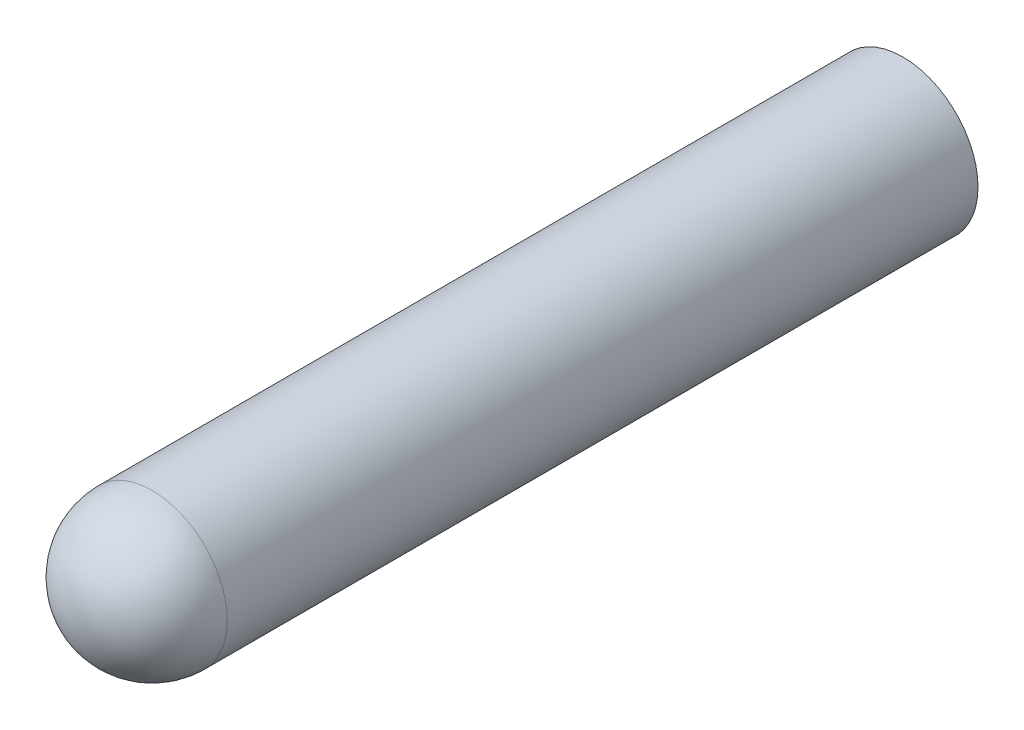
ISO-10303-21;
HEADER;
FILE_DESCRIPTION(('STEP AP214'),'2;1');
FILE_NAME('part.step','',(''),(''),'','','');
FILE_SCHEMA(('AUTOMOTIVE_DESIGN { 1 0 10303 214 1 1 1 1 }'));
ENDSEC;
DATA;
#1=APPLICATION_CONTEXT('core data for automotive mechanical design processes');
#2=APPLICATION_PROTOCOL_DEFINITION('international standard','automotive_design',2000,#1);
#3=PRODUCT_CONTEXT('',#1,'mechanical');
#4=PRODUCT('Part','Part','',(#3));
#5=PRODUCT_RELATED_PRODUCT_CATEGORY('part','',(#4));
#6=PRODUCT_DEFINITION_FORMATION('','',#4);
#7=PRODUCT_DEFINITION_CONTEXT('part definition',#1,'design');
#8=PRODUCT_DEFINITION('design','',#6,#7);
#9=PRODUCT_DEFINITION_SHAPE('','',#8);
#10=(LENGTH_UNIT() NAMED_UNIT(*) SI_UNIT(.MILLI.,.METRE.));
#11=(NAMED_UNIT(*) PLANE_ANGLE_UNIT() SI_UNIT($,.RADIAN.));
#12=(NAMED_UNIT(*) SI_UNIT($,.STERADIAN.) SOLID_ANGLE_UNIT());
#13=UNCERTAINTY_MEASURE_WITH_UNIT(LENGTH_MEASURE(1.E-05),#10,'distance_accuracy_value','');
#14=(GEOMETRIC_REPRESENTATION_CONTEXT(3) GLOBAL_UNCERTAINTY_ASSIGNED_CONTEXT((#13)) GLOBAL_UNIT_ASSIGNED_CONTEXT((#10,
#11,#12)) REPRESENTATION_CONTEXT('',''));
#15=CARTESIAN_POINT('',(0.,0.,0.));
#16=DIRECTION('',(0.,0.,1.));
#17=DIRECTION('',(1.,0.,0.));
#18=AXIS2_PLACEMENT_3D('',#15,#16,#17);
#19=CARTESIAN_POINT('',(0.,0.,5.5));
#20=DIRECTION('',(0.,0.,-1.));
#21=DIRECTION('',(-1.,0.,0.));
#22=AXIS2_PLACEMENT_3D('',#19,#20,#21);
#23=CYLINDRICAL_SURFACE('',#22,1.);
#24=CARTESIAN_POINT('',(0.,0.,4.5));
#25=DIRECTION('',(0.,0.,-1.));
#26=DIRECTION('',(-1.,0.,0.));
#27=AXIS2_PLACEMENT_3D('',#24,#25,#26);
#28=CIRCLE('',#27,1.);
#29=CARTESIAN_POINT('',(-1.,0.,4.5));
#30=VERTEX_POINT('',#29);
#31=EDGE_CURVE('E10',#30,#30,#28,.T.);
#32=ORIENTED_EDGE('',*,*,#31,.T.);
#33=EDGE_LOOP('',(#32));
#34=FACE_BOUND('',#33,.T.);
#35=CARTESIAN_POINT('',(0.,0.,-5.5));
#36=DIRECTION('',(0.,0.,1.));
#37=DIRECTION('',(1.,0.,0.));
#38=AXIS2_PLACEMENT_3D('',#35,#36,#37);
#39=CIRCLE('',#38,1.);
#40=CARTESIAN_POINT('',(1.,0.,-5.5));
#41=VERTEX_POINT('',#40);
#42=EDGE_CURVE('E38',#41,#41,#39,.T.);
#43=ORIENTED_EDGE('',*,*,#42,.T.);
#44=EDGE_LOOP('',(#43));
#45=FACE_BOUND('',#44,.T.);
#46=ADVANCED_FACE('F31',(#34,#45),#23,.T.);
#47=CARTESIAN_POINT('',(0.,0.,-5.5));
#48=DIRECTION('',(0.,0.,1.));
#49=DIRECTION('',(1.,0.,0.));
#50=AXIS2_PLACEMENT_3D('',#47,#48,#49);
#51=PLANE('',#50);
#52=ORIENTED_EDGE('',*,*,#42,.F.);
#53=EDGE_LOOP('',(#52));
#54=FACE_BOUND('',#53,.T.);
#55=ADVANCED_FACE('F45',(#54),#51,.F.);
#56=CARTESIAN_POINT('',(0.,0.,4.5));
#57=DIRECTION('',(0.,0.,1.));
#58=DIRECTION('',(1.,0.,0.));
#59=AXIS2_PLACEMENT_3D('',#56,#57,#58);
#60=SPHERICAL_SURFACE('',#59,1.);
#61=ORIENTED_EDGE('',*,*,#31,.F.);
#62=EDGE_LOOP('',(#61));
#63=FACE_BOUND('',#62,.T.);
#64=ADVANCED_FACE('F33',(#63),#60,.T.);
#65=CLOSED_SHELL('',(#46,#55,#64));
#66=MANIFOLD_SOLID_BREP('B2',#65);
#67=ADVANCED_BREP_SHAPE_REPRESENTATION('',(#18,#66),#14);
#68=SHAPE_DEFINITION_REPRESENTATION(#9,#67);
ENDSEC;
END-ISO-10303-21;
